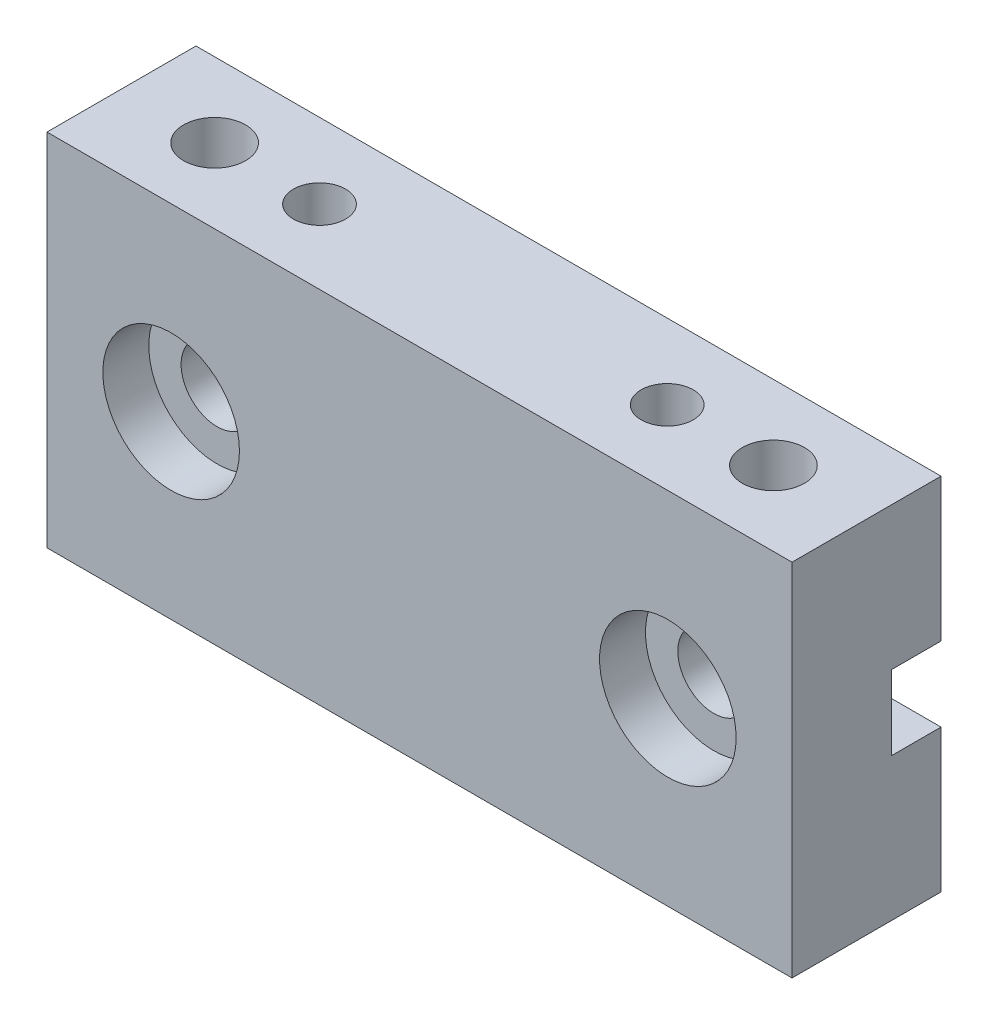
ISO-10303-21;
HEADER;
FILE_DESCRIPTION(('STEP AP214'),'2;1');
FILE_NAME('part.step','',(''),(''),'','','');
FILE_SCHEMA(('AUTOMOTIVE_DESIGN { 1 0 10303 214 1 1 1 1 }'));
ENDSEC;
DATA;
#1=APPLICATION_CONTEXT('core data for automotive mechanical design processes');
#2=APPLICATION_PROTOCOL_DEFINITION('international standard','automotive_design',2000,#1);
#3=PRODUCT_CONTEXT('',#1,'mechanical');
#4=PRODUCT('Part','Part','',(#3));
#5=PRODUCT_RELATED_PRODUCT_CATEGORY('part','',(#4));
#6=PRODUCT_DEFINITION_FORMATION('','',#4);
#7=PRODUCT_DEFINITION_CONTEXT('part definition',#1,'design');
#8=PRODUCT_DEFINITION('design','',#6,#7);
#9=PRODUCT_DEFINITION_SHAPE('','',#8);
#10=(LENGTH_UNIT() NAMED_UNIT(*) SI_UNIT(.MILLI.,.METRE.));
#11=(NAMED_UNIT(*) PLANE_ANGLE_UNIT() SI_UNIT($,.RADIAN.));
#12=(NAMED_UNIT(*) SI_UNIT($,.STERADIAN.) SOLID_ANGLE_UNIT());
#13=UNCERTAINTY_MEASURE_WITH_UNIT(LENGTH_MEASURE(1.E-05),#10,'distance_accuracy_value','');
#14=(GEOMETRIC_REPRESENTATION_CONTEXT(3) GLOBAL_UNCERTAINTY_ASSIGNED_CONTEXT((#13)) GLOBAL_UNIT_ASSIGNED_CONTEXT((#10,
#11,#12)) REPRESENTATION_CONTEXT('',''));
#15=CARTESIAN_POINT('',(0.,0.,0.));
#16=DIRECTION('',(0.,0.,1.));
#17=DIRECTION('',(1.,0.,0.));
#18=AXIS2_PLACEMENT_3D('',#15,#16,#17);
#19=CARTESIAN_POINT('',(0.,11.5,0.));
#20=DIRECTION('',(0.,0.,-1.));
#21=DIRECTION('',(-1.,0.,0.));
#22=AXIS2_PLACEMENT_3D('',#19,#20,#21);
#23=PLANE('',#22);
#24=CARTESIAN_POINT('',(50.,14.5,0.));
#25=DIRECTION('',(0.,0.,1.));
#26=DIRECTION('',(1.,0.,0.));
#27=AXIS2_PLACEMENT_3D('',#24,#25,#26);
#28=CIRCLE('',#27,5.49999999999999);
#29=CARTESIAN_POINT('',(55.5,14.5,0.));
#30=VERTEX_POINT('',#29);
#31=EDGE_CURVE('E158',#30,#30,#28,.T.);
#32=ORIENTED_EDGE('',*,*,#31,.F.);
#33=EDGE_LOOP('',(#32));
#34=FACE_BOUND('',#33,.T.);
#35=CARTESIAN_POINT('',(10.,14.5,0.));
#36=DIRECTION('',(0.,0.,1.));
#37=DIRECTION('',(1.,0.,0.));
#38=AXIS2_PLACEMENT_3D('',#35,#36,#37);
#39=CIRCLE('',#38,5.49999999999999);
#40=CARTESIAN_POINT('',(15.5,14.5,0.));
#41=VERTEX_POINT('',#40);
#42=EDGE_CURVE('E162',#41,#41,#39,.T.);
#43=ORIENTED_EDGE('',*,*,#42,.F.);
#44=EDGE_LOOP('',(#43));
#45=FACE_BOUND('',#44,.T.);
#46=DIRECTION('',(1.,0.,0.));
#47=VECTOR('',#46,1.);
#48=CARTESIAN_POINT('',(0.,0.,0.));
#49=LINE('',#48,#47);
#50=CARTESIAN_POINT('',(0.,0.,0.));
#51=VERTEX_POINT('',#50);
#52=CARTESIAN_POINT('',(60.,0.,0.));
#53=VERTEX_POINT('',#52);
#54=EDGE_CURVE('E165',#51,#53,#49,.T.);
#55=ORIENTED_EDGE('',*,*,#54,.T.);
#56=DIRECTION('',(0.,-1.,0.));
#57=VECTOR('',#56,1.);
#58=CARTESIAN_POINT('',(60.,11.5,0.));
#59=LINE('',#58,#57);
#60=CARTESIAN_POINT('',(60.,29.,0.));
#61=VERTEX_POINT('',#60);
#62=EDGE_CURVE('E168',#61,#53,#59,.T.);
#63=ORIENTED_EDGE('',*,*,#62,.F.);
#64=DIRECTION('',(-1.,0.,0.));
#65=VECTOR('',#64,1.);
#66=CARTESIAN_POINT('',(60.,29.,0.));
#67=LINE('',#66,#65);
#68=CARTESIAN_POINT('',(0.,29.,0.));
#69=VERTEX_POINT('',#68);
#70=EDGE_CURVE('E327',#61,#69,#67,.T.);
#71=ORIENTED_EDGE('',*,*,#70,.T.);
#72=DIRECTION('',(0.,-1.,0.));
#73=VECTOR('',#72,1.);
#74=CARTESIAN_POINT('',(0.,11.5,0.));
#75=LINE('',#74,#73);
#76=EDGE_CURVE('E170',#69,#51,#75,.T.);
#77=ORIENTED_EDGE('',*,*,#76,.T.);
#78=EDGE_LOOP('',(#55,#63,#71,#77));
#79=FACE_BOUND('',#78,.T.);
#80=ADVANCED_FACE('F35',(#34,#45,#79),#23,.F.);
#81=CARTESIAN_POINT('',(60.,11.5,0.));
#82=DIRECTION('',(-1.,0.,0.));
#83=DIRECTION('',(0.,0.,1.));
#84=AXIS2_PLACEMENT_3D('',#81,#82,#83);
#85=PLANE('',#84);
#86=DIRECTION('',(0.,0.,-1.));
#87=VECTOR('',#86,1.);
#88=CARTESIAN_POINT('',(60.,11.5,0.));
#89=LINE('',#88,#87);
#90=CARTESIAN_POINT('',(60.,11.5,-8.));
#91=VERTEX_POINT('',#90);
#92=CARTESIAN_POINT('',(60.,11.5,-12.));
#93=VERTEX_POINT('',#92);
#94=EDGE_CURVE('E189',#91,#93,#89,.T.);
#95=ORIENTED_EDGE('',*,*,#94,.F.);
#96=DIRECTION('',(0.,-1.,0.));
#97=VECTOR('',#96,1.);
#98=CARTESIAN_POINT('',(60.,17.5,-8.));
#99=LINE('',#98,#97);
#100=CARTESIAN_POINT('',(60.,17.5,-8.));
#101=VERTEX_POINT('',#100);
#102=EDGE_CURVE('E179',#101,#91,#99,.T.);
#103=ORIENTED_EDGE('',*,*,#102,.F.);
#104=DIRECTION('',(0.,0.,-1.));
#105=VECTOR('',#104,1.);
#106=CARTESIAN_POINT('',(60.,17.5,0.));
#107=LINE('',#106,#105);
#108=CARTESIAN_POINT('',(60.,17.5,-12.));
#109=VERTEX_POINT('',#108);
#110=EDGE_CURVE('E287',#101,#109,#107,.T.);
#111=ORIENTED_EDGE('',*,*,#110,.T.);
#112=DIRECTION('',(0.,1.,0.));
#113=VECTOR('',#112,1.);
#114=CARTESIAN_POINT('',(60.,17.5,-12.));
#115=LINE('',#114,#113);
#116=CARTESIAN_POINT('',(60.,29.,-12.));
#117=VERTEX_POINT('',#116);
#118=EDGE_CURVE('E334',#109,#117,#115,.T.);
#119=ORIENTED_EDGE('',*,*,#118,.T.);
#120=DIRECTION('',(0.,0.,1.));
#121=VECTOR('',#120,1.);
#122=CARTESIAN_POINT('',(60.,29.,0.));
#123=LINE('',#122,#121);
#124=EDGE_CURVE('E331',#117,#61,#123,.T.);
#125=ORIENTED_EDGE('',*,*,#124,.T.);
#126=ORIENTED_EDGE('',*,*,#62,.T.);
#127=DIRECTION('',(0.,0.,-1.));
#128=VECTOR('',#127,1.);
#129=CARTESIAN_POINT('',(60.,0.,0.));
#130=LINE('',#129,#128);
#131=CARTESIAN_POINT('',(60.,0.,-12.));
#132=VERTEX_POINT('',#131);
#133=EDGE_CURVE('E173',#53,#132,#130,.T.);
#134=ORIENTED_EDGE('',*,*,#133,.T.);
#135=DIRECTION('',(0.,-1.,0.));
#136=VECTOR('',#135,1.);
#137=CARTESIAN_POINT('',(60.,11.5,-12.));
#138=LINE('',#137,#136);
#139=EDGE_CURVE('E194',#93,#132,#138,.T.);
#140=ORIENTED_EDGE('',*,*,#139,.F.);
#141=EDGE_LOOP('',(#95,#103,#111,#119,#125,#126,#134,#140));
#142=FACE_BOUND('',#141,.T.);
#143=ADVANCED_FACE('F148',(#142),#85,.F.);
#144=CARTESIAN_POINT('',(0.,11.5,-12.));
#145=DIRECTION('',(0.,0.,-1.));
#146=DIRECTION('',(-1.,0.,0.));
#147=AXIS2_PLACEMENT_3D('',#144,#145,#146);
#148=PLANE('',#147);
#149=DIRECTION('',(1.,0.,0.));
#150=VECTOR('',#149,1.);
#151=CARTESIAN_POINT('',(0.,0.,-12.));
#152=LINE('',#151,#150);
#153=CARTESIAN_POINT('',(0.,0.,-12.));
#154=VERTEX_POINT('',#153);
#155=EDGE_CURVE('E176',#154,#132,#152,.T.);
#156=ORIENTED_EDGE('',*,*,#155,.F.);
#157=DIRECTION('',(0.,-1.,0.));
#158=VECTOR('',#157,1.);
#159=CARTESIAN_POINT('',(0.,11.5,-12.));
#160=LINE('',#159,#158);
#161=CARTESIAN_POINT('',(0.,11.5,-12.));
#162=VERTEX_POINT('',#161);
#163=EDGE_CURVE('E191',#162,#154,#160,.T.);
#164=ORIENTED_EDGE('',*,*,#163,.F.);
#165=DIRECTION('',(1.,0.,0.));
#166=VECTOR('',#165,1.);
#167=CARTESIAN_POINT('',(0.,11.5,-12.));
#168=LINE('',#167,#166);
#169=EDGE_CURVE('E308',#162,#93,#168,.T.);
#170=ORIENTED_EDGE('',*,*,#169,.T.);
#171=ORIENTED_EDGE('',*,*,#139,.T.);
#172=EDGE_LOOP('',(#156,#164,#170,#171));
#173=FACE_BOUND('',#172,.T.);
#174=ADVANCED_FACE('F153',(#173),#148,.T.);
#175=CARTESIAN_POINT('',(0.,11.5,0.));
#176=DIRECTION('',(-1.,0.,0.));
#177=DIRECTION('',(0.,0.,1.));
#178=AXIS2_PLACEMENT_3D('',#175,#176,#177);
#179=PLANE('',#178);
#180=ORIENTED_EDGE('',*,*,#163,.T.);
#181=DIRECTION('',(0.,0.,-1.));
#182=VECTOR('',#181,1.);
#183=CARTESIAN_POINT('',(0.,0.,0.));
#184=LINE('',#183,#182);
#185=EDGE_CURVE('E187',#51,#154,#184,.T.);
#186=ORIENTED_EDGE('',*,*,#185,.F.);
#187=ORIENTED_EDGE('',*,*,#76,.F.);
#188=DIRECTION('',(0.,0.,1.));
#189=VECTOR('',#188,1.);
#190=CARTESIAN_POINT('',(0.,29.,0.));
#191=LINE('',#190,#189);
#192=CARTESIAN_POINT('',(0.,29.,-12.));
#193=VERTEX_POINT('',#192);
#194=EDGE_CURVE('E322',#193,#69,#191,.T.);
#195=ORIENTED_EDGE('',*,*,#194,.F.);
#196=DIRECTION('',(0.,1.,0.));
#197=VECTOR('',#196,1.);
#198=CARTESIAN_POINT('',(0.,17.5,-12.));
#199=LINE('',#198,#197);
#200=CARTESIAN_POINT('',(0.,17.5,-12.));
#201=VERTEX_POINT('',#200);
#202=EDGE_CURVE('E329',#201,#193,#199,.T.);
#203=ORIENTED_EDGE('',*,*,#202,.F.);
#204=DIRECTION('',(0.,0.,-1.));
#205=VECTOR('',#204,1.);
#206=CARTESIAN_POINT('',(0.,17.5,0.));
#207=LINE('',#206,#205);
#208=CARTESIAN_POINT('',(0.,17.5,-8.));
#209=VERTEX_POINT('',#208);
#210=EDGE_CURVE('E202',#209,#201,#207,.T.);
#211=ORIENTED_EDGE('',*,*,#210,.F.);
#212=DIRECTION('',(0.,-1.,0.));
#213=VECTOR('',#212,1.);
#214=CARTESIAN_POINT('',(0.,17.5,-8.));
#215=LINE('',#214,#213);
#216=CARTESIAN_POINT('',(0.,11.5,-8.));
#217=VERTEX_POINT('',#216);
#218=EDGE_CURVE('E300',#209,#217,#215,.T.);
#219=ORIENTED_EDGE('',*,*,#218,.T.);
#220=DIRECTION('',(0.,0.,-1.));
#221=VECTOR('',#220,1.);
#222=CARTESIAN_POINT('',(0.,11.5,0.));
#223=LINE('',#222,#221);
#224=EDGE_CURVE('E182',#217,#162,#223,.T.);
#225=ORIENTED_EDGE('',*,*,#224,.T.);
#226=EDGE_LOOP('',(#180,#186,#187,#195,#203,#211,#219,#225));
#227=FACE_BOUND('',#226,.T.);
#228=ADVANCED_FACE('F313',(#227),#179,.T.);
#229=CARTESIAN_POINT('',(0.,11.5,0.));
#230=DIRECTION('',(0.,1.,0.));
#231=DIRECTION('',(0.,0.,1.));
#232=AXIS2_PLACEMENT_3D('',#229,#230,#231);
#233=PLANE('',#232);
#234=DIRECTION('',(-1.,0.,0.));
#235=VECTOR('',#234,1.);
#236=CARTESIAN_POINT('',(0.,11.5,-8.));
#237=LINE('',#236,#235);
#238=EDGE_CURVE('E174',#91,#217,#237,.T.);
#239=ORIENTED_EDGE('',*,*,#238,.F.);
#240=ORIENTED_EDGE('',*,*,#94,.T.);
#241=ORIENTED_EDGE('',*,*,#169,.F.);
#242=ORIENTED_EDGE('',*,*,#224,.F.);
#243=EDGE_LOOP('',(#239,#240,#241,#242));
#244=FACE_BOUND('',#243,.T.);
#245=ADVANCED_FACE('F316',(#244),#233,.T.);
#246=CARTESIAN_POINT('',(0.,0.,0.));
#247=DIRECTION('',(0.,1.,0.));
#248=DIRECTION('',(0.,0.,1.));
#249=AXIS2_PLACEMENT_3D('',#246,#247,#248);
#250=PLANE('',#249);
#251=ORIENTED_EDGE('',*,*,#155,.T.);
#252=ORIENTED_EDGE('',*,*,#133,.F.);
#253=ORIENTED_EDGE('',*,*,#54,.F.);
#254=ORIENTED_EDGE('',*,*,#185,.T.);
#255=EDGE_LOOP('',(#251,#252,#253,#254));
#256=FACE_BOUND('',#255,.T.);
#257=ADVANCED_FACE('F277',(#256),#250,.F.);
#258=CARTESIAN_POINT('',(0.,17.5,-8.));
#259=DIRECTION('',(0.,0.,-1.));
#260=DIRECTION('',(-1.,0.,0.));
#261=AXIS2_PLACEMENT_3D('',#258,#259,#260);
#262=PLANE('',#261);
#263=DIRECTION('',(0.,1.,0.));
#264=VECTOR('',#263,1.);
#265=CARTESIAN_POINT('',(43.5530751552984,29.,-8.));
#266=LINE('',#265,#264);
#267=CARTESIAN_POINT('',(43.5530751552984,16.6,-8.));
#268=VERTEX_POINT('',#267);
#269=CARTESIAN_POINT('',(43.5530751552984,17.5,-8.));
#270=VERTEX_POINT('',#269);
#271=EDGE_CURVE('E11',#268,#270,#266,.T.);
#272=ORIENTED_EDGE('',*,*,#271,.F.);
#273=CARTESIAN_POINT('',(49.015420985392,18.5942089842032,-8.));
#274=CARTESIAN_POINT('',(48.8951759842451,18.5273464544686,-8.));
#275=CARTESIAN_POINT('',(48.7747903455765,18.460735009919,-8.));
#276=CARTESIAN_POINT('',(48.5336620716978,18.3281579246327,-8.));
#277=CARTESIAN_POINT('',(48.4129194317649,18.2621922924897,-8.));
#278=CARTESIAN_POINT('',(48.1708049242427,18.1309439936334,-8.));
#279=CARTESIAN_POINT('',(48.0494323469175,18.0656626343111,-8.));
#280=CARTESIAN_POINT('',(47.8061528628542,17.9360990005382,-8.));
#281=CARTESIAN_POINT('',(47.6842459509435,17.8718167357867,-8.));
#282=CARTESIAN_POINT('',(47.4339889700188,17.741518735037,-8.));
#283=CARTESIAN_POINT('',(47.3056067108165,17.6755646786685,-8.));
#284=CARTESIAN_POINT('',(47.0479133953454,17.5454982625345,-8.));
#285=CARTESIAN_POINT('',(46.9186023611506,17.4813858591787,-8.));
#286=CARTESIAN_POINT('',(46.6588787024535,17.3556861226602,-8.));
#287=CARTESIAN_POINT('',(46.528467024027,17.2940968437731,-8.));
#288=CARTESIAN_POINT('',(46.2660568166439,17.1743090019116,-8.));
#289=CARTESIAN_POINT('',(46.1340580192047,17.1161110226406,-8.));
#290=CARTESIAN_POINT('',(45.8717298014094,17.0060600595334,-8.));
#291=CARTESIAN_POINT('',(45.7414561040848,16.9540755980273,-8.));
#292=CARTESIAN_POINT('',(45.4785402846609,16.8565573809269,-8.));
#293=CARTESIAN_POINT('',(45.3458992318908,16.8110207919239,-8.));
#294=CARTESIAN_POINT('',(45.0792156019848,16.7295363387232,-8.));
#295=CARTESIAN_POINT('',(44.9452040027434,16.6934894834247,-8.));
#296=CARTESIAN_POINT('',(44.6744999680333,16.6338064470224,-8.));
#297=CARTESIAN_POINT('',(44.5378111752374,16.6101544733841,-8.));
#298=CARTESIAN_POINT('',(44.2939924227289,16.5821071628841,-8.));
#299=CARTESIAN_POINT('',(44.1872313808761,16.5745501390752,-8.));
#300=CARTESIAN_POINT('',(43.9735277591663,16.5695279234374,-8.));
#301=CARTESIAN_POINT('',(43.8665853274341,16.5720566542434,-8.));
#302=CARTESIAN_POINT('',(43.6337084049038,16.5883159115783,-8.));
#303=CARTESIAN_POINT('',(43.5079138396787,16.6040289016958,-8.));
#304=CARTESIAN_POINT('',(43.2583213211375,16.6471832980629,-8.));
#305=CARTESIAN_POINT('',(43.1345253407752,16.6746356364556,-8.));
#306=CARTESIAN_POINT('',(42.8875019571257,16.7390247181638,-8.));
#307=CARTESIAN_POINT('',(42.7643107987086,16.7760972716371,-8.));
#308=CARTESIAN_POINT('',(42.5812680868469,16.8367926063737,-8.));
#309=CARTESIAN_POINT('',(42.5205478827571,16.8578708083706,-8.));
#310=CARTESIAN_POINT('',(42.399633917552,16.901480768102,-8.));
#311=CARTESIAN_POINT('',(42.3394401304029,16.9240124534878,-8.));
#312=CARTESIAN_POINT('',(42.1389927873374,17.0013905569305,-8.));
#313=CARTESIAN_POINT('',(41.9998031201879,17.0589909856924,-8.));
#314=CARTESIAN_POINT('',(41.7234214211221,17.1788226338842,-8.));
#315=CARTESIAN_POINT('',(41.5862299208696,17.2410550598027,-8.));
#316=CARTESIAN_POINT('',(41.3132789285137,17.3688359512526,-8.));
#317=CARTESIAN_POINT('',(41.1775206135366,17.4343869197864,-8.));
#318=CARTESIAN_POINT('',(40.9071701678182,17.567857602881,-8.));
#319=CARTESIAN_POINT('',(40.7725781020584,17.6357774483857,-8.));
#320=CARTESIAN_POINT('',(40.5038917701764,17.7735779353952,-8.));
#321=CARTESIAN_POINT('',(40.3698002238739,17.8434638659376,-8.));
#322=CARTESIAN_POINT('',(40.1023237955119,17.9845769131827,-8.));
#323=CARTESIAN_POINT('',(39.9689389241266,18.0558040500704,-8.));
#324=CARTESIAN_POINT('',(39.5697419439264,18.2709521589041,-8.));
#325=CARTESIAN_POINT('',(39.3047574447562,18.4164073452946,-8.));
#326=CARTESIAN_POINT('',(38.8073062365465,18.6926152955897,-8.));
#327=CARTESIAN_POINT('',(38.5746813040323,18.8230846709093,-8.));
#328=CARTESIAN_POINT('',(38.1101957574031,19.085452431106,-8.));
#329=CARTESIAN_POINT('',(37.8783352555284,19.217351014622,-8.));
#330=CARTESIAN_POINT('',(37.4165396728943,19.4813953173783,-8.));
#331=CARTESIAN_POINT('',(37.1866012268634,19.6135351606236,-8.));
#332=CARTESIAN_POINT('',(36.7272033240632,19.87856156801,-8.));
#333=CARTESIAN_POINT('',(36.4977437973466,20.0114480108567,-8.));
#334=CARTESIAN_POINT('',(36.2684394896226,20.1446001737652,-8.));
#335=B_SPLINE_CURVE_WITH_KNOTS('',3,(#273,#274,#275,#276,#277,#278,#279,#280,#281,#282,#283,
#284,#285,#286,#287,#288,#289,#290,#291,#292,#293,#294,#295,#296,#297,#298,#299,#300,#301,#302,
#303,#304,#305,#306,#307,#308,#309,#310,#311,#312,#313,#314,#315,#316,#317,#318,#319,#320,#321,
#322,#323,#324,#325,#326,#327,#328,#329,#330,#331,#332,#333,#334),.UNSPECIFIED.,.F.,.F.,(4,2,2,
2,2,2,2,2,2,2,2,2,2,2,2,2,2,2,2,2,2,2,2,2,2,2,2,2,2,2,4),(0.,0.412754134172796,
0.825513753310912,1.23895484132297,1.65239994050926,2.08538717342407,2.51836414946781,
2.95100069351769,3.38371148345025,3.80438393014178,4.2248709418965,4.64078030922308,
5.05615846284999,5.37679616625644,5.69724069244957,6.0768637472701,6.45684109452526,
6.84250585651447,7.03531657480772,7.22811770311228,7.67988781371685,8.13177601072822,
8.58401027432464,9.03626957572405,9.48989087773727,9.9435190121488,10.8503358111666,
11.6504745624381,12.4507259853064,13.2463334560611,14.0418152068929),.UNSPECIFIED.);
#336=CARTESIAN_POINT('',(44.4469248447016,16.6,-8.));
#337=VERTEX_POINT('',#336);
#338=EDGE_CURVE('E392',#337,#268,#335,.T.);
#339=ORIENTED_EDGE('',*,*,#338,.F.);
#340=DIRECTION('',(0.,1.,0.));
#341=VECTOR('',#340,1.);
#342=CARTESIAN_POINT('',(44.4469248447016,29.,-8.));
#343=LINE('',#342,#341);
#344=CARTESIAN_POINT('',(44.4469248447016,17.5,-8.));
#345=VERTEX_POINT('',#344);
#346=EDGE_CURVE('E42',#345,#337,#343,.F.);
#347=ORIENTED_EDGE('',*,*,#346,.F.);
#348=DIRECTION('',(1.,0.,0.));
#349=VECTOR('',#348,1.);
#350=CARTESIAN_POINT('',(0.,17.5,-8.));
#351=LINE('',#350,#349);
#352=EDGE_CURVE('E282',#345,#101,#351,.T.);
#353=ORIENTED_EDGE('',*,*,#352,.T.);
#354=ORIENTED_EDGE('',*,*,#102,.T.);
#355=ORIENTED_EDGE('',*,*,#238,.T.);
#356=ORIENTED_EDGE('',*,*,#218,.F.);
#357=CARTESIAN_POINT('',(15.5530751552984,17.5,-8.));
#358=VERTEX_POINT('',#357);
#359=EDGE_CURVE('E294',#209,#358,#351,.T.);
#360=ORIENTED_EDGE('',*,*,#359,.T.);
#361=DIRECTION('',(0.,1.,0.));
#362=VECTOR('',#361,1.);
#363=CARTESIAN_POINT('',(15.5530751552984,29.,-8.));
#364=LINE('',#363,#362);
#365=CARTESIAN_POINT('',(15.5530751552984,16.6,-8.));
#366=VERTEX_POINT('',#365);
#367=EDGE_CURVE('E389',#366,#358,#364,.T.);
#368=ORIENTED_EDGE('',*,*,#367,.F.);
#369=CARTESIAN_POINT('',(21.0154209853919,18.5942089842032,-8.));
#370=CARTESIAN_POINT('',(20.8951759842451,18.5273464544686,-8.));
#371=CARTESIAN_POINT('',(20.7747903455765,18.460735009919,-8.));
#372=CARTESIAN_POINT('',(20.5336620716977,18.3281579246327,-8.));
#373=CARTESIAN_POINT('',(20.4129194317648,18.2621922924897,-8.));
#374=CARTESIAN_POINT('',(20.1708049242427,18.1309439936334,-8.));
#375=CARTESIAN_POINT('',(20.0494323469175,18.0656626343111,-8.));
#376=CARTESIAN_POINT('',(19.8061528628542,17.9360990005382,-8.));
#377=CARTESIAN_POINT('',(19.6842459509435,17.8718167357867,-8.));
#378=CARTESIAN_POINT('',(19.4339889700188,17.741518735037,-8.));
#379=CARTESIAN_POINT('',(19.3056067108165,17.6755646786685,-8.));
#380=CARTESIAN_POINT('',(19.0479133953453,17.5454982625345,-8.));
#381=CARTESIAN_POINT('',(18.9186023611505,17.4813858591787,-8.));
#382=CARTESIAN_POINT('',(18.6588787024535,17.3556861226602,-8.));
#383=CARTESIAN_POINT('',(18.5284670240269,17.2940968437731,-8.));
#384=CARTESIAN_POINT('',(18.2660568166439,17.1743090019116,-8.));
#385=CARTESIAN_POINT('',(18.1340580192047,17.1161110226406,-8.));
#386=CARTESIAN_POINT('',(17.8717298014094,17.0060600595334,-8.));
#387=CARTESIAN_POINT('',(17.7414561040848,16.9540755980273,-8.));
#388=CARTESIAN_POINT('',(17.4785402846609,16.8565573809269,-8.));
#389=CARTESIAN_POINT('',(17.3458992318908,16.8110207919239,-8.));
#390=CARTESIAN_POINT('',(17.0792156019848,16.7295363387232,-8.));
#391=CARTESIAN_POINT('',(16.9452040027434,16.6934894834247,-8.));
#392=CARTESIAN_POINT('',(16.6744999680333,16.6338064470224,-8.));
#393=CARTESIAN_POINT('',(16.5378111752374,16.6101544733841,-8.));
#394=CARTESIAN_POINT('',(16.2939924227288,16.5821071628841,-8.));
#395=CARTESIAN_POINT('',(16.187231380876,16.5745501390752,-8.));
#396=CARTESIAN_POINT('',(15.9735277591662,16.5695279234374,-8.));
#397=CARTESIAN_POINT('',(15.866585327434,16.5720566542434,-8.));
#398=CARTESIAN_POINT('',(15.6337084049037,16.5883159115783,-8.));
#399=CARTESIAN_POINT('',(15.5079138396786,16.6040289016958,-8.));
#400=CARTESIAN_POINT('',(15.2583213211375,16.6471832980629,-8.));
#401=CARTESIAN_POINT('',(15.1345253407752,16.6746356364556,-8.));
#402=CARTESIAN_POINT('',(14.8875019571257,16.7390247181638,-8.));
#403=CARTESIAN_POINT('',(14.7643107987086,16.7760972716371,-8.));
#404=CARTESIAN_POINT('',(14.5812680868469,16.8367926063737,-8.));
#405=CARTESIAN_POINT('',(14.5205478827571,16.8578708083706,-8.));
#406=CARTESIAN_POINT('',(14.399633917552,16.9014807681021,-8.));
#407=CARTESIAN_POINT('',(14.3394401304029,16.9240124534878,-8.));
#408=CARTESIAN_POINT('',(14.1389927873374,17.0013905569305,-8.));
#409=CARTESIAN_POINT('',(13.9998031201879,17.0589909856924,-8.));
#410=CARTESIAN_POINT('',(13.7234214211221,17.1788226338842,-8.));
#411=CARTESIAN_POINT('',(13.5862299208696,17.2410550598028,-8.));
#412=CARTESIAN_POINT('',(13.3132789285136,17.3688359512526,-8.));
#413=CARTESIAN_POINT('',(13.1775206135366,17.4343869197864,-8.));
#414=CARTESIAN_POINT('',(12.9071701678182,17.567857602881,-8.));
#415=CARTESIAN_POINT('',(12.7725781020584,17.6357774483857,-8.));
#416=CARTESIAN_POINT('',(12.5038917701764,17.7735779353952,-8.));
#417=CARTESIAN_POINT('',(12.3698002238739,17.8434638659376,-8.));
#418=CARTESIAN_POINT('',(12.1023237955119,17.9845769131827,-8.));
#419=CARTESIAN_POINT('',(11.9689389241266,18.0558040500704,-8.));
#420=CARTESIAN_POINT('',(11.5697419439263,18.2709521589041,-8.));
#421=CARTESIAN_POINT('',(11.3047574447562,18.4164073452946,-8.));
#422=CARTESIAN_POINT('',(10.8073062365465,18.6926152955897,-8.));
#423=CARTESIAN_POINT('',(10.5746813040323,18.8230846709093,-8.));
#424=CARTESIAN_POINT('',(10.1101957574031,19.085452431106,-8.));
#425=CARTESIAN_POINT('',(9.87833525552835,19.217351014622,-8.));
#426=CARTESIAN_POINT('',(9.4165396728943,19.4813953173784,-8.));
#427=CARTESIAN_POINT('',(9.18660122686342,19.6135351606236,-8.));
#428=CARTESIAN_POINT('',(8.7272033240632,19.87856156801,-8.));
#429=CARTESIAN_POINT('',(8.4977437973466,20.0114480108568,-8.));
#430=CARTESIAN_POINT('',(8.2684394896226,20.1446001737652,-8.));
#431=B_SPLINE_CURVE_WITH_KNOTS('',3,(#369,#370,#371,#372,#373,#374,#375,#376,#377,#378,#379,
#380,#381,#382,#383,#384,#385,#386,#387,#388,#389,#390,#391,#392,#393,#394,#395,#396,#397,#398,
#399,#400,#401,#402,#403,#404,#405,#406,#407,#408,#409,#410,#411,#412,#413,#414,#415,#416,#417,
#418,#419,#420,#421,#422,#423,#424,#425,#426,#427,#428,#429,#430),.UNSPECIFIED.,.F.,.F.,(4,2,2,
2,2,2,2,2,2,2,2,2,2,2,2,2,2,2,2,2,2,2,2,2,2,2,2,2,2,2,4),(0.,0.412754134172787,
0.825513753310903,1.23895484132294,1.65239994050926,2.08538717342406,2.5183641494678,
2.95100069351768,3.38371148345023,3.80438393014176,4.22487094189647,4.64078030922304,
5.05615846284996,5.37679616625641,5.69724069244954,6.07686374727007,6.45684109452522,
6.84250585651443,7.03531657480768,7.22811770311224,7.67988781371681,8.13177601072819,
8.58401027432461,9.03626957572403,9.48989087773724,9.94351901214877,10.8503358111666,
11.650474562438,12.4507259853064,13.2463334560611,14.0418152068929),.UNSPECIFIED.);
#432=CARTESIAN_POINT('',(16.4469248447016,16.6,-8.));
#433=VERTEX_POINT('',#432);
#434=EDGE_CURVE('E198',#433,#366,#431,.T.);
#435=ORIENTED_EDGE('',*,*,#434,.F.);
#436=DIRECTION('',(0.,1.,0.));
#437=VECTOR('',#436,1.);
#438=CARTESIAN_POINT('',(16.4469248447016,29.,-8.));
#439=LINE('',#438,#437);
#440=CARTESIAN_POINT('',(16.4469248447016,17.5,-8.));
#441=VERTEX_POINT('',#440);
#442=EDGE_CURVE('E215',#441,#433,#439,.F.);
#443=ORIENTED_EDGE('',*,*,#442,.F.);
#444=EDGE_CURVE('E291',#441,#270,#351,.T.);
#445=ORIENTED_EDGE('',*,*,#444,.T.);
#446=EDGE_LOOP('',(#272,#339,#347,#353,#354,#355,#356,#360,#368,#435,#443,#445));
#447=FACE_BOUND('',#446,.T.);
#448=CARTESIAN_POINT('',(50.,14.5,-8.));
#449=DIRECTION('',(0.,0.,-1.));
#450=DIRECTION('',(-1.,0.,0.));
#451=AXIS2_PLACEMENT_3D('',#448,#449,#450);
#452=CIRCLE('',#451,2.9);
#453=CARTESIAN_POINT('',(47.1,14.5,-8.));
#454=VERTEX_POINT('',#453);
#455=EDGE_CURVE('E204',#454,#454,#452,.T.);
#456=ORIENTED_EDGE('',*,*,#455,.F.);
#457=EDGE_LOOP('',(#456));
#458=FACE_BOUND('',#457,.T.);
#459=CARTESIAN_POINT('',(10.,14.5,-8.));
#460=DIRECTION('',(0.,0.,-1.));
#461=DIRECTION('',(-1.,0.,0.));
#462=AXIS2_PLACEMENT_3D('',#459,#460,#461);
#463=CIRCLE('',#462,2.9);
#464=CARTESIAN_POINT('',(7.1,14.5,-8.));
#465=VERTEX_POINT('',#464);
#466=EDGE_CURVE('E199',#465,#465,#463,.T.);
#467=ORIENTED_EDGE('',*,*,#466,.F.);
#468=EDGE_LOOP('',(#467));
#469=FACE_BOUND('',#468,.T.);
#470=ADVANCED_FACE('F217',(#447,#458,#469),#262,.T.);
#471=CARTESIAN_POINT('',(60.,17.5,0.));
#472=DIRECTION('',(0.,1.,0.));
#473=DIRECTION('',(0.,0.,1.));
#474=AXIS2_PLACEMENT_3D('',#471,#472,#473);
#475=PLANE('',#474);
#476=ORIENTED_EDGE('',*,*,#352,.F.);
#477=CARTESIAN_POINT('',(44.,17.5,-5.9481086327029));
#478=DIRECTION('',(0.,1.,0.));
#479=DIRECTION('',(0.,0.,1.));
#480=AXIS2_PLACEMENT_3D('',#477,#478,#479);
#481=CIRCLE('',#480,2.09999999999999);
#482=EDGE_CURVE('E284',#345,#270,#481,.T.);
#483=ORIENTED_EDGE('',*,*,#482,.T.);
#484=ORIENTED_EDGE('',*,*,#444,.F.);
#485=CARTESIAN_POINT('',(16.,17.5,-5.9481086327029));
#486=DIRECTION('',(0.,1.,0.));
#487=DIRECTION('',(0.,0.,1.));
#488=AXIS2_PLACEMENT_3D('',#485,#486,#487);
#489=CIRCLE('',#488,2.09999999999999);
#490=EDGE_CURVE('E365',#441,#358,#489,.T.);
#491=ORIENTED_EDGE('',*,*,#490,.T.);
#492=ORIENTED_EDGE('',*,*,#359,.F.);
#493=ORIENTED_EDGE('',*,*,#210,.T.);
#494=DIRECTION('',(-1.,0.,0.));
#495=VECTOR('',#494,1.);
#496=CARTESIAN_POINT('',(60.,17.5,-12.));
#497=LINE('',#496,#495);
#498=EDGE_CURVE('E292',#109,#201,#497,.T.);
#499=ORIENTED_EDGE('',*,*,#498,.F.);
#500=ORIENTED_EDGE('',*,*,#110,.F.);
#501=EDGE_LOOP('',(#476,#483,#484,#491,#492,#493,#499,#500));
#502=FACE_BOUND('',#501,.T.);
#503=ADVANCED_FACE('F270',(#502),#475,.F.);
#504=CARTESIAN_POINT('',(60.,17.5,-12.));
#505=DIRECTION('',(0.,0.,1.));
#506=DIRECTION('',(1.,0.,0.));
#507=AXIS2_PLACEMENT_3D('',#504,#505,#506);
#508=PLANE('',#507);
#509=ORIENTED_EDGE('',*,*,#202,.T.);
#510=DIRECTION('',(-1.,0.,0.));
#511=VECTOR('',#510,1.);
#512=CARTESIAN_POINT('',(60.,29.,-12.));
#513=LINE('',#512,#511);
#514=EDGE_CURVE('E296',#117,#193,#513,.T.);
#515=ORIENTED_EDGE('',*,*,#514,.F.);
#516=ORIENTED_EDGE('',*,*,#118,.F.);
#517=ORIENTED_EDGE('',*,*,#498,.T.);
#518=EDGE_LOOP('',(#509,#515,#516,#517));
#519=FACE_BOUND('',#518,.T.);
#520=ADVANCED_FACE('F267',(#519),#508,.F.);
#521=CARTESIAN_POINT('',(60.,29.,0.));
#522=DIRECTION('',(0.,-1.,0.));
#523=DIRECTION('',(0.,0.,-1.));
#524=AXIS2_PLACEMENT_3D('',#521,#522,#523);
#525=PLANE('',#524);
#526=CARTESIAN_POINT('',(44.,29.,-5.9481086327029));
#527=DIRECTION('',(0.,1.,0.));
#528=DIRECTION('',(0.,0.,1.));
#529=AXIS2_PLACEMENT_3D('',#526,#527,#528);
#530=CIRCLE('',#529,2.09999999999999);
#531=CARTESIAN_POINT('',(44.,29.,-3.84810863270291));
#532=VERTEX_POINT('',#531);
#533=EDGE_CURVE('E374',#532,#532,#530,.T.);
#534=ORIENTED_EDGE('',*,*,#533,.F.);
#535=EDGE_LOOP('',(#534));
#536=FACE_BOUND('',#535,.T.);
#537=CARTESIAN_POINT('',(16.,29.,-5.9481086327029));
#538=DIRECTION('',(0.,1.,0.));
#539=DIRECTION('',(0.,0.,1.));
#540=AXIS2_PLACEMENT_3D('',#537,#538,#539);
#541=CIRCLE('',#540,2.09999999999999);
#542=CARTESIAN_POINT('',(16.,29.,-3.84810863270291));
#543=VERTEX_POINT('',#542);
#544=EDGE_CURVE('E369',#543,#543,#541,.T.);
#545=ORIENTED_EDGE('',*,*,#544,.F.);
#546=EDGE_LOOP('',(#545));
#547=FACE_BOUND('',#546,.T.);
#548=CARTESIAN_POINT('',(52.5,29.,-6.));
#549=DIRECTION('',(0.,1.,0.));
#550=DIRECTION('',(0.,0.,1.));
#551=AXIS2_PLACEMENT_3D('',#548,#549,#550);
#552=CIRCLE('',#551,2.49999999999999);
#553=CARTESIAN_POINT('',(52.5,29.,-3.50000000000001));
#554=VERTEX_POINT('',#553);
#555=EDGE_CURVE('E362',#554,#554,#552,.T.);
#556=ORIENTED_EDGE('',*,*,#555,.F.);
#557=EDGE_LOOP('',(#556));
#558=FACE_BOUND('',#557,.T.);
#559=CARTESIAN_POINT('',(7.5,29.,-6.));
#560=DIRECTION('',(0.,1.,0.));
#561=DIRECTION('',(0.,0.,1.));
#562=AXIS2_PLACEMENT_3D('',#559,#560,#561);
#563=CIRCLE('',#562,2.49999999999999);
#564=CARTESIAN_POINT('',(7.5,29.,-3.50000000000001));
#565=VERTEX_POINT('',#564);
#566=EDGE_CURVE('E356',#565,#565,#563,.T.);
#567=ORIENTED_EDGE('',*,*,#566,.F.);
#568=EDGE_LOOP('',(#567));
#569=FACE_BOUND('',#568,.T.);
#570=ORIENTED_EDGE('',*,*,#194,.T.);
#571=ORIENTED_EDGE('',*,*,#70,.F.);
#572=ORIENTED_EDGE('',*,*,#124,.F.);
#573=ORIENTED_EDGE('',*,*,#514,.T.);
#574=EDGE_LOOP('',(#570,#571,#572,#573));
#575=FACE_BOUND('',#574,.T.);
#576=ADVANCED_FACE('F263',(#536,#547,#558,#569,#575),#525,.F.);
#577=CARTESIAN_POINT('',(10.,14.5,0.));
#578=DIRECTION('',(0.,0.,1.));
#579=DIRECTION('',(1.,0.,0.));
#580=AXIS2_PLACEMENT_3D('',#577,#578,#579);
#581=CYLINDRICAL_SURFACE('',#580,2.9);
#582=ORIENTED_EDGE('',*,*,#466,.T.);
#583=EDGE_LOOP('',(#582));
#584=FACE_BOUND('',#583,.T.);
#585=CARTESIAN_POINT('',(10.,14.5,-3.7));
#586=DIRECTION('',(0.,0.,1.));
#587=DIRECTION('',(1.,0.,0.));
#588=AXIS2_PLACEMENT_3D('',#585,#586,#587);
#589=CIRCLE('',#588,2.9);
#590=CARTESIAN_POINT('',(12.9,14.5,-3.7));
#591=VERTEX_POINT('',#590);
#592=EDGE_CURVE('E203',#591,#591,#589,.T.);
#593=ORIENTED_EDGE('',*,*,#592,.T.);
#594=EDGE_LOOP('',(#593));
#595=FACE_BOUND('',#594,.T.);
#596=ADVANCED_FACE('F259',(#584,#595),#581,.F.);
#597=CARTESIAN_POINT('',(12.9,14.5,-3.7));
#598=DIRECTION('',(0.,0.,-1.));
#599=DIRECTION('',(-1.,0.,0.));
#600=AXIS2_PLACEMENT_3D('',#597,#598,#599);
#601=PLANE('',#600);
#602=ORIENTED_EDGE('',*,*,#592,.F.);
#603=EDGE_LOOP('',(#602));
#604=FACE_BOUND('',#603,.T.);
#605=CARTESIAN_POINT('',(10.,14.5,-3.7));
#606=DIRECTION('',(0.,0.,1.));
#607=DIRECTION('',(1.,0.,0.));
#608=AXIS2_PLACEMENT_3D('',#605,#606,#607);
#609=CIRCLE('',#608,5.49999999999999);
#610=CARTESIAN_POINT('',(15.5,14.5,-3.7));
#611=VERTEX_POINT('',#610);
#612=EDGE_CURVE('E343',#611,#611,#609,.T.);
#613=ORIENTED_EDGE('',*,*,#612,.T.);
#614=EDGE_LOOP('',(#613));
#615=FACE_BOUND('',#614,.T.);
#616=ADVANCED_FACE('F255',(#604,#615),#601,.F.);
#617=CARTESIAN_POINT('',(10.,14.5,0.));
#618=DIRECTION('',(0.,0.,1.));
#619=DIRECTION('',(1.,0.,0.));
#620=AXIS2_PLACEMENT_3D('',#617,#618,#619);
#621=CYLINDRICAL_SURFACE('',#620,5.49999999999999);
#622=ORIENTED_EDGE('',*,*,#612,.F.);
#623=EDGE_LOOP('',(#622));
#624=FACE_BOUND('',#623,.T.);
#625=ORIENTED_EDGE('',*,*,#42,.T.);
#626=EDGE_LOOP('',(#625));
#627=FACE_BOUND('',#626,.T.);
#628=ADVANCED_FACE('F251',(#624,#627),#621,.F.);
#629=CARTESIAN_POINT('',(50.,14.5,0.));
#630=DIRECTION('',(0.,0.,1.));
#631=DIRECTION('',(1.,0.,0.));
#632=AXIS2_PLACEMENT_3D('',#629,#630,#631);
#633=CYLINDRICAL_SURFACE('',#632,2.9);
#634=ORIENTED_EDGE('',*,*,#455,.T.);
#635=EDGE_LOOP('',(#634));
#636=FACE_BOUND('',#635,.T.);
#637=CARTESIAN_POINT('',(50.,14.5,-3.7));
#638=DIRECTION('',(0.,0.,1.));
#639=DIRECTION('',(1.,0.,0.));
#640=AXIS2_PLACEMENT_3D('',#637,#638,#639);
#641=CIRCLE('',#640,2.9);
#642=CARTESIAN_POINT('',(52.9,14.5,-3.7));
#643=VERTEX_POINT('',#642);
#644=EDGE_CURVE('E207',#643,#643,#641,.T.);
#645=ORIENTED_EDGE('',*,*,#644,.T.);
#646=EDGE_LOOP('',(#645));
#647=FACE_BOUND('',#646,.T.);
#648=ADVANCED_FACE('F247',(#636,#647),#633,.F.);
#649=CARTESIAN_POINT('',(52.9,14.5,-3.7));
#650=DIRECTION('',(0.,0.,-1.));
#651=DIRECTION('',(-1.,0.,0.));
#652=AXIS2_PLACEMENT_3D('',#649,#650,#651);
#653=PLANE('',#652);
#654=ORIENTED_EDGE('',*,*,#644,.F.);
#655=EDGE_LOOP('',(#654));
#656=FACE_BOUND('',#655,.T.);
#657=CARTESIAN_POINT('',(50.,14.5,-3.7));
#658=DIRECTION('',(0.,0.,1.));
#659=DIRECTION('',(1.,0.,0.));
#660=AXIS2_PLACEMENT_3D('',#657,#658,#659);
#661=CIRCLE('',#660,5.49999999999999);
#662=CARTESIAN_POINT('',(55.5,14.5,-3.7));
#663=VERTEX_POINT('',#662);
#664=EDGE_CURVE('E349',#663,#663,#661,.T.);
#665=ORIENTED_EDGE('',*,*,#664,.T.);
#666=EDGE_LOOP('',(#665));
#667=FACE_BOUND('',#666,.T.);
#668=ADVANCED_FACE('F243',(#656,#667),#653,.F.);
#669=CARTESIAN_POINT('',(50.,14.5,0.));
#670=DIRECTION('',(0.,0.,1.));
#671=DIRECTION('',(1.,0.,0.));
#672=AXIS2_PLACEMENT_3D('',#669,#670,#671);
#673=CYLINDRICAL_SURFACE('',#672,5.49999999999999);
#674=ORIENTED_EDGE('',*,*,#664,.F.);
#675=EDGE_LOOP('',(#674));
#676=FACE_BOUND('',#675,.T.);
#677=ORIENTED_EDGE('',*,*,#31,.T.);
#678=EDGE_LOOP('',(#677));
#679=FACE_BOUND('',#678,.T.);
#680=ADVANCED_FACE('F239',(#676,#679),#673,.F.);
#681=CARTESIAN_POINT('',(7.5,20.,-6.));
#682=DIRECTION('',(0.,1.,0.));
#683=DIRECTION('',(0.,0.,1.));
#684=AXIS2_PLACEMENT_3D('',#681,#682,#683);
#685=CONICAL_SURFACE('',#684,2.5,1.02974425867665);
#686=CARTESIAN_POINT('',(7.5,18.4978484524311,-6.));
#687=VERTEX_POINT('',#686);
#688=VERTEX_LOOP('',#687);
#689=FACE_BOUND('',#688,.T.);
#690=CARTESIAN_POINT('',(7.5,20.,-6.));
#691=DIRECTION('',(0.,1.,0.));
#692=DIRECTION('',(0.,0.,1.));
#693=AXIS2_PLACEMENT_3D('',#690,#691,#692);
#694=CIRCLE('',#693,2.5);
#695=CARTESIAN_POINT('',(7.5,20.,-3.5));
#696=VERTEX_POINT('',#695);
#697=EDGE_CURVE('E353',#696,#696,#694,.T.);
#698=ORIENTED_EDGE('',*,*,#697,.T.);
#699=EDGE_LOOP('',(#698));
#700=FACE_BOUND('',#699,.T.);
#701=ADVANCED_FACE('F235',(#689,#700),#685,.F.);
#702=CARTESIAN_POINT('',(7.5,29.,-6.));
#703=DIRECTION('',(0.,1.,0.));
#704=DIRECTION('',(0.,0.,1.));
#705=AXIS2_PLACEMENT_3D('',#702,#703,#704);
#706=CYLINDRICAL_SURFACE('',#705,2.49999999999999);
#707=ORIENTED_EDGE('',*,*,#697,.F.);
#708=EDGE_LOOP('',(#707));
#709=FACE_BOUND('',#708,.T.);
#710=ORIENTED_EDGE('',*,*,#566,.T.);
#711=EDGE_LOOP('',(#710));
#712=FACE_BOUND('',#711,.T.);
#713=ADVANCED_FACE('F231',(#709,#712),#706,.F.);
#714=CARTESIAN_POINT('',(52.5,20.,-6.));
#715=DIRECTION('',(0.,1.,0.));
#716=DIRECTION('',(0.,0.,1.));
#717=AXIS2_PLACEMENT_3D('',#714,#715,#716);
#718=CONICAL_SURFACE('',#717,2.49999999999999,1.02974425867665);
#719=CARTESIAN_POINT('',(52.5,18.4978484524311,-6.));
#720=VERTEX_POINT('',#719);
#721=VERTEX_LOOP('',#720);
#722=FACE_BOUND('',#721,.T.);
#723=CARTESIAN_POINT('',(52.5,20.,-6.));
#724=DIRECTION('',(0.,1.,0.));
#725=DIRECTION('',(0.,0.,1.));
#726=AXIS2_PLACEMENT_3D('',#723,#724,#725);
#727=CIRCLE('',#726,2.49999999999999);
#728=CARTESIAN_POINT('',(52.5,20.,-3.50000000000001));
#729=VERTEX_POINT('',#728);
#730=EDGE_CURVE('E359',#729,#729,#727,.T.);
#731=ORIENTED_EDGE('',*,*,#730,.T.);
#732=EDGE_LOOP('',(#731));
#733=FACE_BOUND('',#732,.T.);
#734=ADVANCED_FACE('F227',(#722,#733),#718,.F.);
#735=CARTESIAN_POINT('',(52.5,29.,-6.));
#736=DIRECTION('',(0.,1.,0.));
#737=DIRECTION('',(0.,0.,1.));
#738=AXIS2_PLACEMENT_3D('',#735,#736,#737);
#739=CYLINDRICAL_SURFACE('',#738,2.49999999999999);
#740=ORIENTED_EDGE('',*,*,#730,.F.);
#741=EDGE_LOOP('',(#740));
#742=FACE_BOUND('',#741,.T.);
#743=ORIENTED_EDGE('',*,*,#555,.T.);
#744=EDGE_LOOP('',(#743));
#745=FACE_BOUND('',#744,.T.);
#746=ADVANCED_FACE('F224',(#742,#745),#739,.F.);
#747=CARTESIAN_POINT('',(16.,16.6,-5.9481086327029));
#748=DIRECTION('',(0.,1.,0.));
#749=DIRECTION('',(0.,0.,1.));
#750=AXIS2_PLACEMENT_3D('',#747,#748,#749);
#751=CONICAL_SURFACE('',#750,2.09999999999999,1.02974425867665);
#752=ORIENTED_EDGE('',*,*,#434,.T.);
#753=CARTESIAN_POINT('',(16.,16.6,-5.9481086327029));
#754=DIRECTION('',(0.,1.,0.));
#755=DIRECTION('',(0.,0.,1.));
#756=AXIS2_PLACEMENT_3D('',#753,#754,#755);
#757=CIRCLE('',#756,2.09999999999999);
#758=EDGE_CURVE('E55',#366,#433,#757,.T.);
#759=ORIENTED_EDGE('',*,*,#758,.T.);
#760=EDGE_LOOP('',(#752,#759));
#761=FACE_BOUND('',#760,.T.);
#762=CARTESIAN_POINT('',(16.,15.3381927000421,-5.9481086327029));
#763=VERTEX_POINT('',#762);
#764=VERTEX_LOOP('',#763);
#765=FACE_BOUND('',#764,.T.);
#766=ADVANCED_FACE('F143',(#761,#765),#751,.F.);
#767=CARTESIAN_POINT('',(16.,29.,-5.9481086327029));
#768=DIRECTION('',(0.,1.,0.));
#769=DIRECTION('',(0.,0.,1.));
#770=AXIS2_PLACEMENT_3D('',#767,#768,#769);
#771=CYLINDRICAL_SURFACE('',#770,2.09999999999999);
#772=ORIENTED_EDGE('',*,*,#367,.T.);
#773=ORIENTED_EDGE('',*,*,#490,.F.);
#774=ORIENTED_EDGE('',*,*,#442,.T.);
#775=ORIENTED_EDGE('',*,*,#758,.F.);
#776=EDGE_LOOP('',(#772,#773,#774,#775));
#777=FACE_BOUND('',#776,.T.);
#778=ORIENTED_EDGE('',*,*,#544,.T.);
#779=EDGE_LOOP('',(#778));
#780=FACE_BOUND('',#779,.T.);
#781=ADVANCED_FACE('F135',(#777,#780),#771,.F.);
#782=CARTESIAN_POINT('',(44.,16.6,-5.9481086327029));
#783=DIRECTION('',(0.,1.,0.));
#784=DIRECTION('',(0.,0.,1.));
#785=AXIS2_PLACEMENT_3D('',#782,#783,#784);
#786=CONICAL_SURFACE('',#785,2.09999999999999,1.02974425867666);
#787=ORIENTED_EDGE('',*,*,#338,.T.);
#788=CARTESIAN_POINT('',(44.,16.6,-5.9481086327029));
#789=DIRECTION('',(0.,1.,0.));
#790=DIRECTION('',(0.,0.,1.));
#791=AXIS2_PLACEMENT_3D('',#788,#789,#790);
#792=CIRCLE('',#791,2.09999999999999);
#793=EDGE_CURVE('E48',#268,#337,#792,.T.);
#794=ORIENTED_EDGE('',*,*,#793,.T.);
#795=EDGE_LOOP('',(#787,#794));
#796=FACE_BOUND('',#795,.T.);
#797=CARTESIAN_POINT('',(44.,15.3381927000421,-5.9481086327029));
#798=VERTEX_POINT('',#797);
#799=VERTEX_LOOP('',#798);
#800=FACE_BOUND('',#799,.T.);
#801=ADVANCED_FACE('F132',(#796,#800),#786,.F.);
#802=CARTESIAN_POINT('',(44.,29.,-5.9481086327029));
#803=DIRECTION('',(0.,1.,0.));
#804=DIRECTION('',(0.,0.,1.));
#805=AXIS2_PLACEMENT_3D('',#802,#803,#804);
#806=CYLINDRICAL_SURFACE('',#805,2.09999999999999);
#807=ORIENTED_EDGE('',*,*,#271,.T.);
#808=ORIENTED_EDGE('',*,*,#482,.F.);
#809=ORIENTED_EDGE('',*,*,#346,.T.);
#810=ORIENTED_EDGE('',*,*,#793,.F.);
#811=EDGE_LOOP('',(#807,#808,#809,#810));
#812=FACE_BOUND('',#811,.T.);
#813=ORIENTED_EDGE('',*,*,#533,.T.);
#814=EDGE_LOOP('',(#813));
#815=FACE_BOUND('',#814,.T.);
#816=ADVANCED_FACE('F134',(#812,#815),#806,.F.);
#817=CLOSED_SHELL('',(#80,#143,#174,#228,#245,#257,#470,#503,#520,#576,#596,#616,#628,#648,#668,
#680,#701,#713,#734,#746,#766,#781,#801,#816));
#818=MANIFOLD_SOLID_BREP('B2',#817);
#819=ADVANCED_BREP_SHAPE_REPRESENTATION('',(#18,#818),#14);
#820=SHAPE_DEFINITION_REPRESENTATION(#9,#819);
ENDSEC;
END-ISO-10303-21;
